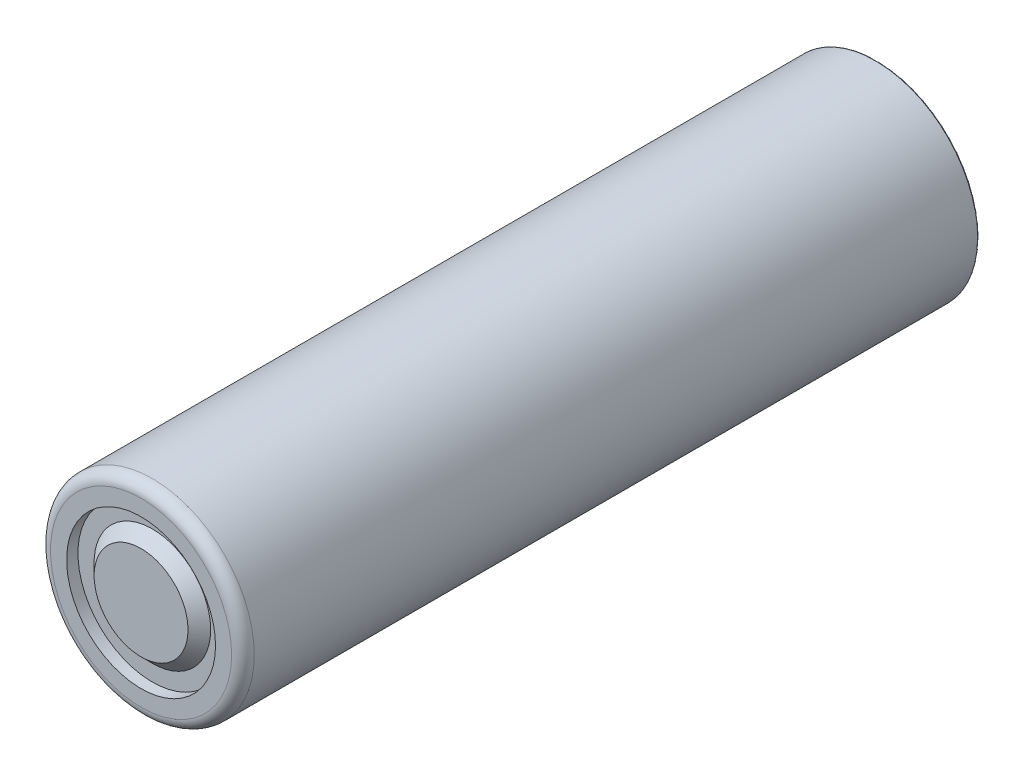
ISO-10303-21;
HEADER;
FILE_DESCRIPTION(('STEP AP214'),'2;1');
FILE_NAME('part.step','',(''),(''),'','','');
FILE_SCHEMA(('AUTOMOTIVE_DESIGN { 1 0 10303 214 1 1 1 1 }'));
ENDSEC;
DATA;
#1=APPLICATION_CONTEXT('core data for automotive mechanical design processes');
#2=APPLICATION_PROTOCOL_DEFINITION('international standard','automotive_design',2000,#1);
#3=PRODUCT_CONTEXT('',#1,'mechanical');
#4=PRODUCT('Part','Part','',(#3));
#5=PRODUCT_RELATED_PRODUCT_CATEGORY('part','',(#4));
#6=PRODUCT_DEFINITION_FORMATION('','',#4);
#7=PRODUCT_DEFINITION_CONTEXT('part definition',#1,'design');
#8=PRODUCT_DEFINITION('design','',#6,#7);
#9=PRODUCT_DEFINITION_SHAPE('','',#8);
#10=(LENGTH_UNIT() NAMED_UNIT(*) SI_UNIT(.MILLI.,.METRE.));
#11=(NAMED_UNIT(*) PLANE_ANGLE_UNIT() SI_UNIT($,.RADIAN.));
#12=(NAMED_UNIT(*) SI_UNIT($,.STERADIAN.) SOLID_ANGLE_UNIT());
#13=UNCERTAINTY_MEASURE_WITH_UNIT(LENGTH_MEASURE(1.E-05),#10,'distance_accuracy_value','');
#14=(GEOMETRIC_REPRESENTATION_CONTEXT(3) GLOBAL_UNCERTAINTY_ASSIGNED_CONTEXT((#13)) GLOBAL_UNIT_ASSIGNED_CONTEXT((#10,
#11,#12)) REPRESENTATION_CONTEXT('',''));
#15=CARTESIAN_POINT('',(0.,0.,0.));
#16=DIRECTION('',(0.,0.,1.));
#17=DIRECTION('',(1.,0.,0.));
#18=AXIS2_PLACEMENT_3D('',#15,#16,#17);
#19=CARTESIAN_POINT('',(0.,0.,65.));
#20=DIRECTION('',(0.,0.,-1.));
#21=DIRECTION('',(-1.,0.,0.));
#22=AXIS2_PLACEMENT_3D('',#19,#20,#21);
#23=CYLINDRICAL_SURFACE('',#22,9.);
#24=CARTESIAN_POINT('',(0.,0.,0.100000000000003));
#25=DIRECTION('',(0.,0.,1.));
#26=DIRECTION('',(1.,0.,0.));
#27=AXIS2_PLACEMENT_3D('',#24,#25,#26);
#28=CIRCLE('',#27,9.);
#29=CARTESIAN_POINT('',(9.,0.,0.100000000000003));
#30=VERTEX_POINT('',#29);
#31=EDGE_CURVE('E40',#30,#30,#28,.T.);
#32=ORIENTED_EDGE('',*,*,#31,.T.);
#33=EDGE_LOOP('',(#32));
#34=FACE_BOUND('',#33,.T.);
#35=CARTESIAN_POINT('',(0.,0.,64.));
#36=DIRECTION('',(0.,0.,1.));
#37=DIRECTION('',(1.,0.,0.));
#38=AXIS2_PLACEMENT_3D('',#35,#36,#37);
#39=CIRCLE('',#38,9.);
#40=CARTESIAN_POINT('',(9.,0.,64.));
#41=VERTEX_POINT('',#40);
#42=EDGE_CURVE('E48',#41,#41,#39,.F.);
#43=ORIENTED_EDGE('',*,*,#42,.T.);
#44=EDGE_LOOP('',(#43));
#45=FACE_BOUND('',#44,.T.);
#46=ADVANCED_FACE('F33',(#34,#45),#23,.T.);
#47=CARTESIAN_POINT('',(0.,0.,65.));
#48=DIRECTION('',(0.,0.,1.));
#49=DIRECTION('',(1.,0.,0.));
#50=AXIS2_PLACEMENT_3D('',#47,#48,#49);
#51=PLANE('',#50);
#52=CARTESIAN_POINT('',(0.,0.,65.));
#53=DIRECTION('',(0.,0.,1.));
#54=DIRECTION('',(1.,0.,0.));
#55=AXIS2_PLACEMENT_3D('',#52,#53,#54);
#56=CIRCLE('',#55,8.);
#57=CARTESIAN_POINT('',(8.,0.,65.));
#58=VERTEX_POINT('',#57);
#59=EDGE_CURVE('E53',#58,#58,#56,.T.);
#60=ORIENTED_EDGE('',*,*,#59,.T.);
#61=EDGE_LOOP('',(#60));
#62=FACE_BOUND('',#61,.T.);
#63=CARTESIAN_POINT('',(0.,0.,65.));
#64=DIRECTION('',(0.,0.,1.));
#65=DIRECTION('',(1.,0.,0.));
#66=AXIS2_PLACEMENT_3D('',#63,#64,#65);
#67=CIRCLE('',#66,6.57645662334501);
#68=CARTESIAN_POINT('',(6.57645662334501,0.,65.));
#69=VERTEX_POINT('',#68);
#70=EDGE_CURVE('E57',#69,#69,#67,.T.);
#71=ORIENTED_EDGE('',*,*,#70,.F.);
#72=EDGE_LOOP('',(#71));
#73=FACE_BOUND('',#72,.T.);
#74=ADVANCED_FACE('F97',(#62,#73),#51,.T.);
#75=CARTESIAN_POINT('',(0.,0.,0.));
#76=DIRECTION('',(0.,0.,1.));
#77=DIRECTION('',(1.,0.,0.));
#78=AXIS2_PLACEMENT_3D('',#75,#76,#77);
#79=PLANE('',#78);
#80=CARTESIAN_POINT('',(0.,0.,0.));
#81=DIRECTION('',(0.,0.,1.));
#82=DIRECTION('',(1.,0.,0.));
#83=AXIS2_PLACEMENT_3D('',#80,#81,#82);
#84=CIRCLE('',#83,8.9);
#85=CARTESIAN_POINT('',(8.9,0.,0.));
#86=VERTEX_POINT('',#85);
#87=EDGE_CURVE('E10',#86,#86,#84,.F.);
#88=ORIENTED_EDGE('',*,*,#87,.T.);
#89=EDGE_LOOP('',(#88));
#90=FACE_BOUND('',#89,.T.);
#91=CARTESIAN_POINT('',(0.,0.,0.));
#92=DIRECTION('',(0.,0.,-1.));
#93=DIRECTION('',(-1.,0.,0.));
#94=AXIS2_PLACEMENT_3D('',#91,#92,#93);
#95=CIRCLE('',#94,8.24633038048806);
#96=CARTESIAN_POINT('',(-8.24633038048806,0.,0.));
#97=VERTEX_POINT('',#96);
#98=EDGE_CURVE('E66',#97,#97,#95,.T.);
#99=ORIENTED_EDGE('',*,*,#98,.F.);
#100=EDGE_LOOP('',(#99));
#101=FACE_BOUND('',#100,.T.);
#102=ADVANCED_FACE('F94',(#90,#101),#79,.F.);
#103=CARTESIAN_POINT('',(0.,0.,64.));
#104=DIRECTION('',(0.,0.,1.));
#105=DIRECTION('',(1.,0.,0.));
#106=AXIS2_PLACEMENT_3D('',#103,#104,#105);
#107=CYLINDRICAL_SURFACE('',#106,6.57645662334501);
#108=CARTESIAN_POINT('',(0.,0.,64.));
#109=DIRECTION('',(0.,0.,1.));
#110=DIRECTION('',(1.,0.,0.));
#111=AXIS2_PLACEMENT_3D('',#108,#109,#110);
#112=CIRCLE('',#111,6.57645662334501);
#113=CARTESIAN_POINT('',(6.57645662334501,0.,64.));
#114=VERTEX_POINT('',#113);
#115=EDGE_CURVE('E56',#114,#114,#112,.T.);
#116=ORIENTED_EDGE('',*,*,#115,.F.);
#117=EDGE_LOOP('',(#116));
#118=FACE_BOUND('',#117,.T.);
#119=ORIENTED_EDGE('',*,*,#70,.T.);
#120=EDGE_LOOP('',(#119));
#121=FACE_BOUND('',#120,.T.);
#122=ADVANCED_FACE('F96',(#118,#121),#107,.F.);
#123=CARTESIAN_POINT('',(0.,0.,64.));
#124=DIRECTION('',(0.,0.,1.));
#125=DIRECTION('',(1.,0.,0.));
#126=AXIS2_PLACEMENT_3D('',#123,#124,#125);
#127=PLANE('',#126);
#128=CARTESIAN_POINT('',(0.,0.,64.));
#129=DIRECTION('',(0.,0.,1.));
#130=DIRECTION('',(1.,0.,0.));
#131=AXIS2_PLACEMENT_3D('',#128,#129,#130);
#132=CIRCLE('',#131,5.14671910285336);
#133=CARTESIAN_POINT('',(5.14671910285336,0.,64.));
#134=VERTEX_POINT('',#133);
#135=EDGE_CURVE('E60',#134,#134,#132,.T.);
#136=ORIENTED_EDGE('',*,*,#135,.F.);
#137=EDGE_LOOP('',(#136));
#138=FACE_BOUND('',#137,.T.);
#139=ORIENTED_EDGE('',*,*,#115,.T.);
#140=EDGE_LOOP('',(#139));
#141=FACE_BOUND('',#140,.T.);
#142=ADVANCED_FACE('F104',(#138,#141),#127,.T.);
#143=CARTESIAN_POINT('',(0.,0.,65.));
#144=DIRECTION('',(0.,0.,1.));
#145=DIRECTION('',(1.,0.,0.));
#146=AXIS2_PLACEMENT_3D('',#143,#144,#145);
#147=CIRCLE('',#146,4.14671910285336);
#148=CARTESIAN_POINT('',(4.14671910285336,0.,65.));
#149=VERTEX_POINT('',#148);
#150=EDGE_CURVE('E44',#149,#149,#147,.T.);
#151=ORIENTED_EDGE('',*,*,#150,.T.);
#152=EDGE_LOOP('',(#151));
#153=FACE_BOUND('',#152,.T.);
#154=ADVANCED_FACE('F109',(#153),#51,.T.);
#155=CARTESIAN_POINT('',(0.,0.,64.));
#156=DIRECTION('',(0.,0.,1.));
#157=DIRECTION('',(1.,0.,0.));
#158=AXIS2_PLACEMENT_3D('',#155,#156,#157);
#159=TOROIDAL_SURFACE('',#158,8.,1.);
#160=ORIENTED_EDGE('',*,*,#42,.F.);
#161=EDGE_LOOP('',(#160));
#162=FACE_BOUND('',#161,.T.);
#163=ORIENTED_EDGE('',*,*,#59,.F.);
#164=EDGE_LOOP('',(#163));
#165=FACE_BOUND('',#164,.T.);
#166=ADVANCED_FACE('F118',(#162,#165),#159,.T.);
#167=CARTESIAN_POINT('',(0.,0.,65.));
#168=DIRECTION('',(0.,0.,-1.));
#169=DIRECTION('',(-1.,0.,0.));
#170=AXIS2_PLACEMENT_3D('',#167,#168,#169);
#171=CONICAL_SURFACE('',#170,4.14671910285336,0.785398163397449);
#172=ORIENTED_EDGE('',*,*,#135,.T.);
#173=EDGE_LOOP('',(#172));
#174=FACE_BOUND('',#173,.T.);
#175=ORIENTED_EDGE('',*,*,#150,.F.);
#176=EDGE_LOOP('',(#175));
#177=FACE_BOUND('',#176,.T.);
#178=ADVANCED_FACE('F90',(#174,#177),#171,.T.);
#179=CARTESIAN_POINT('',(0.,0.,0.4));
#180=DIRECTION('',(0.,0.,-1.));
#181=DIRECTION('',(-1.,0.,0.));
#182=AXIS2_PLACEMENT_3D('',#179,#180,#181);
#183=CYLINDRICAL_SURFACE('',#182,8.24633038048806);
#184=CARTESIAN_POINT('',(0.,0.,0.4));
#185=DIRECTION('',(0.,0.,-1.));
#186=DIRECTION('',(-1.,0.,0.));
#187=AXIS2_PLACEMENT_3D('',#184,#185,#186);
#188=CIRCLE('',#187,8.24633038048806);
#189=CARTESIAN_POINT('',(-8.24633038048806,0.,0.4));
#190=VERTEX_POINT('',#189);
#191=EDGE_CURVE('E65',#190,#190,#188,.T.);
#192=ORIENTED_EDGE('',*,*,#191,.F.);
#193=EDGE_LOOP('',(#192));
#194=FACE_BOUND('',#193,.T.);
#195=ORIENTED_EDGE('',*,*,#98,.T.);
#196=EDGE_LOOP('',(#195));
#197=FACE_BOUND('',#196,.T.);
#198=ADVANCED_FACE('F84',(#194,#197),#183,.F.);
#199=CARTESIAN_POINT('',(0.,0.,0.4));
#200=DIRECTION('',(0.,0.,-1.));
#201=DIRECTION('',(-1.,0.,0.));
#202=AXIS2_PLACEMENT_3D('',#199,#200,#201);
#203=PLANE('',#202);
#204=CARTESIAN_POINT('',(0.,0.,0.4));
#205=DIRECTION('',(0.,0.,-1.));
#206=DIRECTION('',(-1.,0.,0.));
#207=AXIS2_PLACEMENT_3D('',#204,#205,#206);
#208=CIRCLE('',#207,7.78668087122645);
#209=CARTESIAN_POINT('',(-7.78668087122645,0.,0.4));
#210=VERTEX_POINT('',#209);
#211=EDGE_CURVE('E69',#210,#210,#208,.T.);
#212=ORIENTED_EDGE('',*,*,#211,.F.);
#213=EDGE_LOOP('',(#212));
#214=FACE_BOUND('',#213,.T.);
#215=ORIENTED_EDGE('',*,*,#191,.T.);
#216=EDGE_LOOP('',(#215));
#217=FACE_BOUND('',#216,.T.);
#218=ADVANCED_FACE('F81',(#214,#217),#203,.T.);
#219=CARTESIAN_POINT('',(0.,0.,0.4));
#220=DIRECTION('',(0.,0.,-1.));
#221=DIRECTION('',(-1.,0.,0.));
#222=AXIS2_PLACEMENT_3D('',#219,#220,#221);
#223=CYLINDRICAL_SURFACE('',#222,7.78668087122645);
#224=ORIENTED_EDGE('',*,*,#211,.T.);
#225=EDGE_LOOP('',(#224));
#226=FACE_BOUND('',#225,.T.);
#227=CARTESIAN_POINT('',(0.,0.,0.));
#228=DIRECTION('',(0.,0.,-1.));
#229=DIRECTION('',(-1.,0.,0.));
#230=AXIS2_PLACEMENT_3D('',#227,#228,#229);
#231=CIRCLE('',#230,7.78668087122645);
#232=CARTESIAN_POINT('',(-7.78668087122645,0.,0.));
#233=VERTEX_POINT('',#232);
#234=EDGE_CURVE('E72',#233,#233,#231,.T.);
#235=ORIENTED_EDGE('',*,*,#234,.F.);
#236=EDGE_LOOP('',(#235));
#237=FACE_BOUND('',#236,.T.);
#238=ADVANCED_FACE('F78',(#226,#237),#223,.T.);
#239=ORIENTED_EDGE('',*,*,#234,.T.);
#240=EDGE_LOOP('',(#239));
#241=FACE_BOUND('',#240,.T.);
#242=ADVANCED_FACE('F99',(#241),#79,.F.);
#243=CARTESIAN_POINT('',(0.,0.,0.100000000000003));
#244=DIRECTION('',(0.,0.,1.));
#245=DIRECTION('',(1.,0.,0.));
#246=AXIS2_PLACEMENT_3D('',#243,#244,#245);
#247=TOROIDAL_SURFACE('',#246,8.9,0.1);
#248=ORIENTED_EDGE('',*,*,#87,.F.);
#249=EDGE_LOOP('',(#248));
#250=FACE_BOUND('',#249,.T.);
#251=ORIENTED_EDGE('',*,*,#31,.F.);
#252=EDGE_LOOP('',(#251));
#253=FACE_BOUND('',#252,.T.);
#254=ADVANCED_FACE('F35',(#250,#253),#247,.T.);
#255=CLOSED_SHELL('',(#46,#74,#102,#122,#142,#154,#166,#178,#198,#218,#238,#242,#254));
#256=MANIFOLD_SOLID_BREP('B2',#255);
#257=ADVANCED_BREP_SHAPE_REPRESENTATION('',(#18,#256),#14);
#258=SHAPE_DEFINITION_REPRESENTATION(#9,#257);
ENDSEC;
END-ISO-10303-21;
